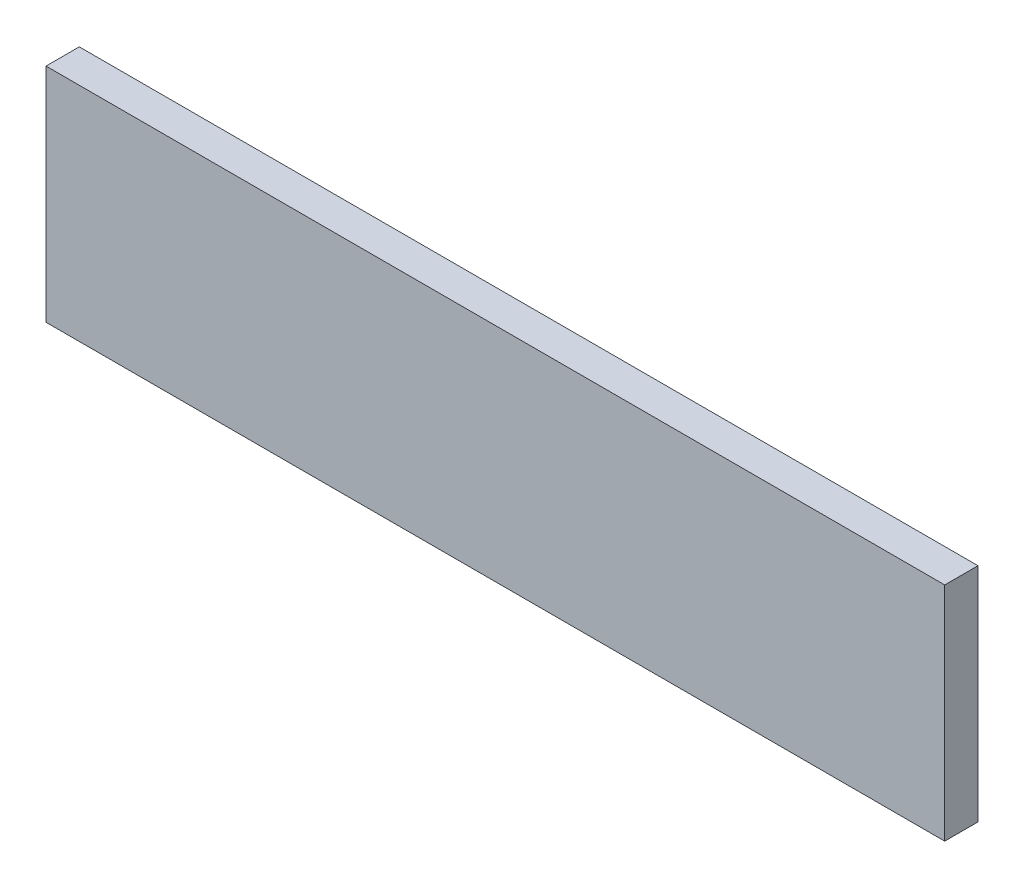
ISO-10303-21;
HEADER;
FILE_DESCRIPTION(('STEP AP214'),'2;1');
FILE_NAME('part.step','',(''),(''),'','','');
FILE_SCHEMA(('AUTOMOTIVE_DESIGN { 1 0 10303 214 1 1 1 1 }'));
ENDSEC;
DATA;
#1=APPLICATION_CONTEXT('core data for automotive mechanical design processes');
#2=APPLICATION_PROTOCOL_DEFINITION('international standard','automotive_design',2000,#1);
#3=PRODUCT_CONTEXT('',#1,'mechanical');
#4=PRODUCT('Part','Part','',(#3));
#5=PRODUCT_RELATED_PRODUCT_CATEGORY('part','',(#4));
#6=PRODUCT_DEFINITION_FORMATION('','',#4);
#7=PRODUCT_DEFINITION_CONTEXT('part definition',#1,'design');
#8=PRODUCT_DEFINITION('design','',#6,#7);
#9=PRODUCT_DEFINITION_SHAPE('','',#8);
#10=(LENGTH_UNIT() NAMED_UNIT(*) SI_UNIT(.MILLI.,.METRE.));
#11=(NAMED_UNIT(*) PLANE_ANGLE_UNIT() SI_UNIT($,.RADIAN.));
#12=(NAMED_UNIT(*) SI_UNIT($,.STERADIAN.) SOLID_ANGLE_UNIT());
#13=UNCERTAINTY_MEASURE_WITH_UNIT(LENGTH_MEASURE(1.E-05),#10,'distance_accuracy_value','');
#14=(GEOMETRIC_REPRESENTATION_CONTEXT(3) GLOBAL_UNCERTAINTY_ASSIGNED_CONTEXT((#13)) GLOBAL_UNIT_ASSIGNED_CONTEXT((#10,
#11,#12)) REPRESENTATION_CONTEXT('',''));
#15=CARTESIAN_POINT('',(0.,0.,0.));
#16=DIRECTION('',(0.,0.,1.));
#17=DIRECTION('',(1.,0.,0.));
#18=AXIS2_PLACEMENT_3D('',#15,#16,#17);
#19=CARTESIAN_POINT('',(0.,0.,19.05));
#20=DIRECTION('',(-1.,0.,0.));
#21=DIRECTION('',(0.,0.,1.));
#22=AXIS2_PLACEMENT_3D('',#19,#20,#21);
#23=PLANE('',#22);
#24=DIRECTION('',(0.,1.,0.));
#25=VECTOR('',#24,1.);
#26=CARTESIAN_POINT('',(0.,0.,0.));
#27=LINE('',#26,#25);
#28=CARTESIAN_POINT('',(0.,0.,0.));
#29=VERTEX_POINT('',#28);
#30=CARTESIAN_POINT('',(0.,127.,0.));
#31=VERTEX_POINT('',#30);
#32=EDGE_CURVE('E98',#29,#31,#27,.T.);
#33=ORIENTED_EDGE('',*,*,#32,.F.);
#34=DIRECTION('',(0.,0.,-1.));
#35=VECTOR('',#34,1.);
#36=CARTESIAN_POINT('',(0.,0.,19.05));
#37=LINE('',#36,#35);
#38=CARTESIAN_POINT('',(0.,0.,19.05));
#39=VERTEX_POINT('',#38);
#40=EDGE_CURVE('E11',#39,#29,#37,.T.);
#41=ORIENTED_EDGE('',*,*,#40,.F.);
#42=DIRECTION('',(0.,1.,0.));
#43=VECTOR('',#42,1.);
#44=CARTESIAN_POINT('',(0.,0.,19.05));
#45=LINE('',#44,#43);
#46=CARTESIAN_POINT('',(0.,127.,19.05));
#47=VERTEX_POINT('',#46);
#48=EDGE_CURVE('E93',#39,#47,#45,.T.);
#49=ORIENTED_EDGE('',*,*,#48,.T.);
#50=DIRECTION('',(0.,0.,-1.));
#51=VECTOR('',#50,1.);
#52=CARTESIAN_POINT('',(0.,127.,19.05));
#53=LINE('',#52,#51);
#54=EDGE_CURVE('E36',#47,#31,#53,.T.);
#55=ORIENTED_EDGE('',*,*,#54,.T.);
#56=EDGE_LOOP('',(#33,#41,#49,#55));
#57=FACE_BOUND('',#56,.T.);
#58=ADVANCED_FACE('F33',(#57),#23,.T.);
#59=CARTESIAN_POINT('',(0.,0.,19.05));
#60=DIRECTION('',(0.,1.,0.));
#61=DIRECTION('',(0.,0.,1.));
#62=AXIS2_PLACEMENT_3D('',#59,#60,#61);
#63=PLANE('',#62);
#64=DIRECTION('',(1.,0.,0.));
#65=VECTOR('',#64,1.);
#66=CARTESIAN_POINT('',(0.,0.,0.));
#67=LINE('',#66,#65);
#68=CARTESIAN_POINT('',(514.35,0.,0.));
#69=VERTEX_POINT('',#68);
#70=EDGE_CURVE('E66',#29,#69,#67,.T.);
#71=ORIENTED_EDGE('',*,*,#70,.T.);
#72=DIRECTION('',(0.,0.,-1.));
#73=VECTOR('',#72,1.);
#74=CARTESIAN_POINT('',(514.35,0.,19.05));
#75=LINE('',#74,#73);
#76=CARTESIAN_POINT('',(514.35,0.,19.05));
#77=VERTEX_POINT('',#76);
#78=EDGE_CURVE('E42',#77,#69,#75,.T.);
#79=ORIENTED_EDGE('',*,*,#78,.F.);
#80=DIRECTION('',(1.,0.,0.));
#81=VECTOR('',#80,1.);
#82=CARTESIAN_POINT('',(0.,0.,19.05));
#83=LINE('',#82,#81);
#84=EDGE_CURVE('E83',#39,#77,#83,.T.);
#85=ORIENTED_EDGE('',*,*,#84,.F.);
#86=ORIENTED_EDGE('',*,*,#40,.T.);
#87=EDGE_LOOP('',(#71,#79,#85,#86));
#88=FACE_BOUND('',#87,.T.);
#89=ADVANCED_FACE('F108',(#88),#63,.F.);
#90=CARTESIAN_POINT('',(514.35,0.,19.05));
#91=DIRECTION('',(-1.,0.,0.));
#92=DIRECTION('',(0.,0.,1.));
#93=AXIS2_PLACEMENT_3D('',#90,#91,#92);
#94=PLANE('',#93);
#95=DIRECTION('',(0.,1.,0.));
#96=VECTOR('',#95,1.);
#97=CARTESIAN_POINT('',(514.35,0.,0.));
#98=LINE('',#97,#96);
#99=CARTESIAN_POINT('',(514.35,127.,0.));
#100=VERTEX_POINT('',#99);
#101=EDGE_CURVE('E90',#69,#100,#98,.T.);
#102=ORIENTED_EDGE('',*,*,#101,.T.);
#103=DIRECTION('',(0.,0.,-1.));
#104=VECTOR('',#103,1.);
#105=CARTESIAN_POINT('',(514.35,127.,19.05));
#106=LINE('',#105,#104);
#107=CARTESIAN_POINT('',(514.35,127.,19.05));
#108=VERTEX_POINT('',#107);
#109=EDGE_CURVE('E87',#108,#100,#106,.T.);
#110=ORIENTED_EDGE('',*,*,#109,.F.);
#111=DIRECTION('',(0.,1.,0.));
#112=VECTOR('',#111,1.);
#113=CARTESIAN_POINT('',(514.35,0.,19.05));
#114=LINE('',#113,#112);
#115=EDGE_CURVE('E78',#77,#108,#114,.T.);
#116=ORIENTED_EDGE('',*,*,#115,.F.);
#117=ORIENTED_EDGE('',*,*,#78,.T.);
#118=EDGE_LOOP('',(#102,#110,#116,#117));
#119=FACE_BOUND('',#118,.T.);
#120=ADVANCED_FACE('F88',(#119),#94,.F.);
#121=CARTESIAN_POINT('',(0.,127.,19.05));
#122=DIRECTION('',(0.,1.,0.));
#123=DIRECTION('',(0.,0.,1.));
#124=AXIS2_PLACEMENT_3D('',#121,#122,#123);
#125=PLANE('',#124);
#126=DIRECTION('',(1.,0.,0.));
#127=VECTOR('',#126,1.);
#128=CARTESIAN_POINT('',(0.,127.,0.));
#129=LINE('',#128,#127);
#130=EDGE_CURVE('E101',#31,#100,#129,.T.);
#131=ORIENTED_EDGE('',*,*,#130,.F.);
#132=ORIENTED_EDGE('',*,*,#54,.F.);
#133=DIRECTION('',(1.,0.,0.));
#134=VECTOR('',#133,1.);
#135=CARTESIAN_POINT('',(0.,127.,19.05));
#136=LINE('',#135,#134);
#137=EDGE_CURVE('E82',#47,#108,#136,.T.);
#138=ORIENTED_EDGE('',*,*,#137,.T.);
#139=ORIENTED_EDGE('',*,*,#109,.T.);
#140=EDGE_LOOP('',(#131,#132,#138,#139));
#141=FACE_BOUND('',#140,.T.);
#142=ADVANCED_FACE('F92',(#141),#125,.T.);
#143=CARTESIAN_POINT('',(0.,0.,19.05));
#144=DIRECTION('',(0.,0.,-1.));
#145=DIRECTION('',(-1.,0.,0.));
#146=AXIS2_PLACEMENT_3D('',#143,#144,#145);
#147=PLANE('',#146);
#148=ORIENTED_EDGE('',*,*,#48,.F.);
#149=ORIENTED_EDGE('',*,*,#84,.T.);
#150=ORIENTED_EDGE('',*,*,#115,.T.);
#151=ORIENTED_EDGE('',*,*,#137,.F.);
#152=EDGE_LOOP('',(#148,#149,#150,#151));
#153=FACE_BOUND('',#152,.T.);
#154=ADVANCED_FACE('F81',(#153),#147,.F.);
#155=CARTESIAN_POINT('',(0.,0.,0.));
#156=DIRECTION('',(0.,0.,-1.));
#157=DIRECTION('',(-1.,0.,0.));
#158=AXIS2_PLACEMENT_3D('',#155,#156,#157);
#159=PLANE('',#158);
#160=ORIENTED_EDGE('',*,*,#32,.T.);
#161=ORIENTED_EDGE('',*,*,#130,.T.);
#162=ORIENTED_EDGE('',*,*,#101,.F.);
#163=ORIENTED_EDGE('',*,*,#70,.F.);
#164=EDGE_LOOP('',(#160,#161,#162,#163));
#165=FACE_BOUND('',#164,.T.);
#166=ADVANCED_FACE('F106',(#165),#159,.T.);
#167=CLOSED_SHELL('',(#58,#89,#120,#142,#154,#166));
#168=MANIFOLD_SOLID_BREP('B2',#167);
#169=ADVANCED_BREP_SHAPE_REPRESENTATION('',(#18,#168),#14);
#170=SHAPE_DEFINITION_REPRESENTATION(#9,#169);
ENDSEC;
END-ISO-10303-21;
